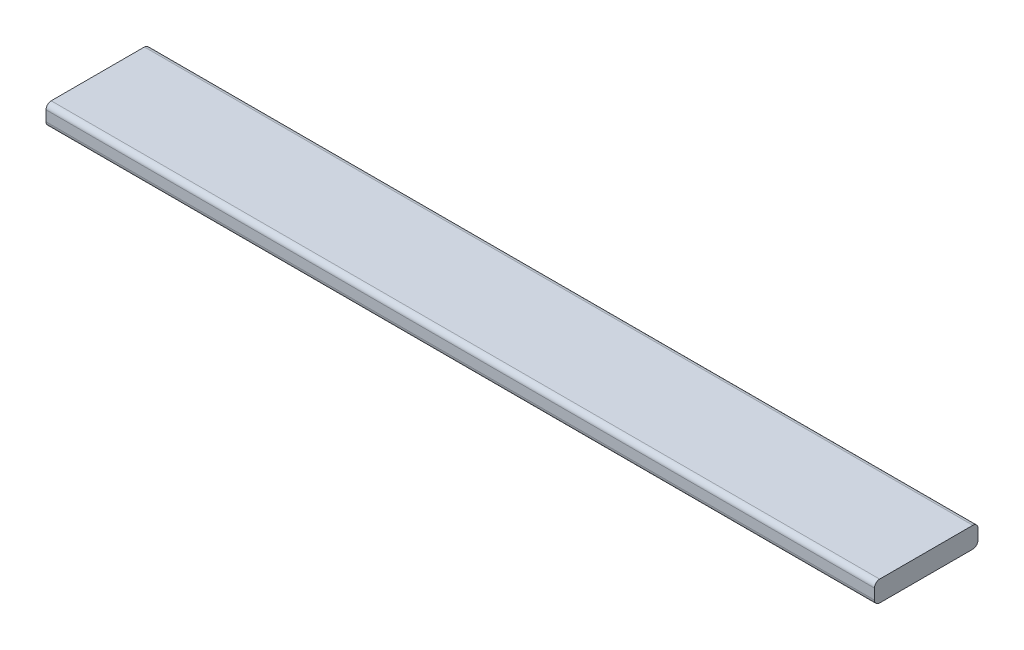
ISO-10303-21;
HEADER;
FILE_DESCRIPTION(('STEP AP214'),'2;1');
FILE_NAME('part.step','',(''),(''),'','','');
FILE_SCHEMA(('AUTOMOTIVE_DESIGN { 1 0 10303 214 1 1 1 1 }'));
ENDSEC;
DATA;
#1=APPLICATION_CONTEXT('core data for automotive mechanical design processes');
#2=APPLICATION_PROTOCOL_DEFINITION('international standard','automotive_design',2000,#1);
#3=PRODUCT_CONTEXT('',#1,'mechanical');
#4=PRODUCT('Part','Part','',(#3));
#5=PRODUCT_RELATED_PRODUCT_CATEGORY('part','',(#4));
#6=PRODUCT_DEFINITION_FORMATION('','',#4);
#7=PRODUCT_DEFINITION_CONTEXT('part definition',#1,'design');
#8=PRODUCT_DEFINITION('design','',#6,#7);
#9=PRODUCT_DEFINITION_SHAPE('','',#8);
#10=(LENGTH_UNIT() NAMED_UNIT(*) SI_UNIT(.MILLI.,.METRE.));
#11=(NAMED_UNIT(*) PLANE_ANGLE_UNIT() SI_UNIT($,.RADIAN.));
#12=(NAMED_UNIT(*) SI_UNIT($,.STERADIAN.) SOLID_ANGLE_UNIT());
#13=UNCERTAINTY_MEASURE_WITH_UNIT(LENGTH_MEASURE(1.E-05),#10,'distance_accuracy_value','');
#14=(GEOMETRIC_REPRESENTATION_CONTEXT(3) GLOBAL_UNCERTAINTY_ASSIGNED_CONTEXT((#13)) GLOBAL_UNIT_ASSIGNED_CONTEXT((#10,
#11,#12)) REPRESENTATION_CONTEXT('',''));
#15=CARTESIAN_POINT('',(0.,0.,0.));
#16=DIRECTION('',(0.,0.,1.));
#17=DIRECTION('',(1.,0.,0.));
#18=AXIS2_PLACEMENT_3D('',#15,#16,#17);
#19=CARTESIAN_POINT('',(60.,1.5,7.5));
#20=DIRECTION('',(-1.,0.,0.));
#21=DIRECTION('',(0.,0.,1.));
#22=AXIS2_PLACEMENT_3D('',#19,#20,#21);
#23=PLANE('',#22);
#24=DIRECTION('',(0.,0.,-1.));
#25=VECTOR('',#24,1.);
#26=CARTESIAN_POINT('',(60.,-1.5,7.5));
#27=LINE('',#26,#25);
#28=CARTESIAN_POINT('',(60.,-1.5,6.75));
#29=VERTEX_POINT('',#28);
#30=CARTESIAN_POINT('',(60.,-1.5,-6.75));
#31=VERTEX_POINT('',#30);
#32=EDGE_CURVE('E173',#29,#31,#27,.T.);
#33=ORIENTED_EDGE('',*,*,#32,.T.);
#34=CARTESIAN_POINT('',(60.,-0.75,-6.75));
#35=DIRECTION('',(-1.,0.,0.));
#36=DIRECTION('',(0.,0.,1.));
#37=AXIS2_PLACEMENT_3D('',#34,#35,#36);
#38=CIRCLE('',#37,0.75);
#39=CARTESIAN_POINT('',(60.,-0.75,-7.5));
#40=VERTEX_POINT('',#39);
#41=EDGE_CURVE('E147',#31,#40,#38,.F.);
#42=ORIENTED_EDGE('',*,*,#41,.T.);
#43=DIRECTION('',(0.,-1.,0.));
#44=VECTOR('',#43,1.);
#45=CARTESIAN_POINT('',(60.,1.5,-7.5));
#46=LINE('',#45,#44);
#47=CARTESIAN_POINT('',(60.,0.75,-7.5));
#48=VERTEX_POINT('',#47);
#49=EDGE_CURVE('E126',#48,#40,#46,.T.);
#50=ORIENTED_EDGE('',*,*,#49,.F.);
#51=CARTESIAN_POINT('',(60.,0.75,-6.75));
#52=DIRECTION('',(-1.,0.,0.));
#53=DIRECTION('',(0.,0.,1.));
#54=AXIS2_PLACEMENT_3D('',#51,#52,#53);
#55=CIRCLE('',#54,0.75);
#56=CARTESIAN_POINT('',(60.,1.5,-6.75));
#57=VERTEX_POINT('',#56);
#58=EDGE_CURVE('E131',#48,#57,#55,.F.);
#59=ORIENTED_EDGE('',*,*,#58,.T.);
#60=DIRECTION('',(0.,0.,-1.));
#61=VECTOR('',#60,1.);
#62=CARTESIAN_POINT('',(60.,1.5,7.5));
#63=LINE('',#62,#61);
#64=CARTESIAN_POINT('',(60.,1.5,6.75));
#65=VERTEX_POINT('',#64);
#66=EDGE_CURVE('E168',#65,#57,#63,.T.);
#67=ORIENTED_EDGE('',*,*,#66,.F.);
#68=CARTESIAN_POINT('',(60.,0.75,6.75));
#69=DIRECTION('',(-1.,0.,0.));
#70=DIRECTION('',(0.,0.,1.));
#71=AXIS2_PLACEMENT_3D('',#68,#69,#70);
#72=CIRCLE('',#71,0.75);
#73=CARTESIAN_POINT('',(60.,0.75,7.5));
#74=VERTEX_POINT('',#73);
#75=EDGE_CURVE('E61',#65,#74,#72,.F.);
#76=ORIENTED_EDGE('',*,*,#75,.T.);
#77=DIRECTION('',(0.,-1.,0.));
#78=VECTOR('',#77,1.);
#79=CARTESIAN_POINT('',(60.,1.5,7.5));
#80=LINE('',#79,#78);
#81=CARTESIAN_POINT('',(60.,-0.75,7.5));
#82=VERTEX_POINT('',#81);
#83=EDGE_CURVE('E158',#74,#82,#80,.T.);
#84=ORIENTED_EDGE('',*,*,#83,.T.);
#85=CARTESIAN_POINT('',(60.,-0.75,6.75));
#86=DIRECTION('',(-1.,0.,0.));
#87=DIRECTION('',(0.,0.,1.));
#88=AXIS2_PLACEMENT_3D('',#85,#86,#87);
#89=CIRCLE('',#88,0.75);
#90=EDGE_CURVE('E54',#82,#29,#89,.F.);
#91=ORIENTED_EDGE('',*,*,#90,.T.);
#92=EDGE_LOOP('',(#33,#42,#50,#59,#67,#76,#84,#91));
#93=FACE_BOUND('',#92,.T.);
#94=ADVANCED_FACE('F39',(#93),#23,.F.);
#95=CARTESIAN_POINT('',(-60.,1.5,-7.5));
#96=DIRECTION('',(0.,0.,1.));
#97=DIRECTION('',(1.,0.,0.));
#98=AXIS2_PLACEMENT_3D('',#95,#96,#97);
#99=PLANE('',#98);
#100=ORIENTED_EDGE('',*,*,#49,.T.);
#101=DIRECTION('',(-1.,0.,0.));
#102=VECTOR('',#101,1.);
#103=CARTESIAN_POINT('',(-60.,-0.75,-7.5));
#104=LINE('',#103,#102);
#105=CARTESIAN_POINT('',(-60.,-0.75,-7.5));
#106=VERTEX_POINT('',#105);
#107=EDGE_CURVE('E125',#40,#106,#104,.T.);
#108=ORIENTED_EDGE('',*,*,#107,.T.);
#109=DIRECTION('',(0.,-1.,0.));
#110=VECTOR('',#109,1.);
#111=CARTESIAN_POINT('',(-60.,1.5,-7.5));
#112=LINE('',#111,#110);
#113=CARTESIAN_POINT('',(-60.,0.75,-7.5));
#114=VERTEX_POINT('',#113);
#115=EDGE_CURVE('E108',#114,#106,#112,.T.);
#116=ORIENTED_EDGE('',*,*,#115,.F.);
#117=DIRECTION('',(-1.,0.,0.));
#118=VECTOR('',#117,1.);
#119=CARTESIAN_POINT('',(-60.,0.75,-7.5));
#120=LINE('',#119,#118);
#121=EDGE_CURVE('E122',#114,#48,#120,.F.);
#122=ORIENTED_EDGE('',*,*,#121,.T.);
#123=EDGE_LOOP('',(#100,#108,#116,#122));
#124=FACE_BOUND('',#123,.T.);
#125=ADVANCED_FACE('F121',(#124),#99,.F.);
#126=CARTESIAN_POINT('',(-60.,1.5,7.5));
#127=DIRECTION('',(1.,0.,0.));
#128=DIRECTION('',(0.,0.,-1.));
#129=AXIS2_PLACEMENT_3D('',#126,#127,#128);
#130=PLANE('',#129);
#131=ORIENTED_EDGE('',*,*,#115,.T.);
#132=CARTESIAN_POINT('',(-60.,-0.75,-6.75));
#133=DIRECTION('',(1.,0.,0.));
#134=DIRECTION('',(0.,0.,-1.));
#135=AXIS2_PLACEMENT_3D('',#132,#133,#134);
#136=CIRCLE('',#135,0.75);
#137=CARTESIAN_POINT('',(-60.,-1.5,-6.75));
#138=VERTEX_POINT('',#137);
#139=EDGE_CURVE('E115',#106,#138,#136,.F.);
#140=ORIENTED_EDGE('',*,*,#139,.T.);
#141=DIRECTION('',(0.,0.,1.));
#142=VECTOR('',#141,1.);
#143=CARTESIAN_POINT('',(-60.,-1.5,7.5));
#144=LINE('',#143,#142);
#145=CARTESIAN_POINT('',(-60.,-1.5,6.75));
#146=VERTEX_POINT('',#145);
#147=EDGE_CURVE('E170',#138,#146,#144,.T.);
#148=ORIENTED_EDGE('',*,*,#147,.T.);
#149=CARTESIAN_POINT('',(-60.,-0.75,6.75));
#150=DIRECTION('',(1.,0.,0.));
#151=DIRECTION('',(0.,0.,-1.));
#152=AXIS2_PLACEMENT_3D('',#149,#150,#151);
#153=CIRCLE('',#152,0.75);
#154=CARTESIAN_POINT('',(-60.,-0.75,7.5));
#155=VERTEX_POINT('',#154);
#156=EDGE_CURVE('E116',#146,#155,#153,.F.);
#157=ORIENTED_EDGE('',*,*,#156,.T.);
#158=DIRECTION('',(0.,-1.,0.));
#159=VECTOR('',#158,1.);
#160=CARTESIAN_POINT('',(-60.,1.5,7.5));
#161=LINE('',#160,#159);
#162=CARTESIAN_POINT('',(-60.,0.75,7.5));
#163=VERTEX_POINT('',#162);
#164=EDGE_CURVE('E127',#163,#155,#161,.T.);
#165=ORIENTED_EDGE('',*,*,#164,.F.);
#166=CARTESIAN_POINT('',(-60.,0.75,6.75));
#167=DIRECTION('',(1.,0.,0.));
#168=DIRECTION('',(0.,0.,-1.));
#169=AXIS2_PLACEMENT_3D('',#166,#167,#168);
#170=CIRCLE('',#169,0.75);
#171=CARTESIAN_POINT('',(-60.,1.5,6.75));
#172=VERTEX_POINT('',#171);
#173=EDGE_CURVE('E133',#163,#172,#170,.F.);
#174=ORIENTED_EDGE('',*,*,#173,.T.);
#175=DIRECTION('',(0.,0.,1.));
#176=VECTOR('',#175,1.);
#177=CARTESIAN_POINT('',(-60.,1.5,7.5));
#178=LINE('',#177,#176);
#179=CARTESIAN_POINT('',(-60.,1.5,-6.75));
#180=VERTEX_POINT('',#179);
#181=EDGE_CURVE('E110',#180,#172,#178,.T.);
#182=ORIENTED_EDGE('',*,*,#181,.F.);
#183=CARTESIAN_POINT('',(-60.,0.75,-6.75));
#184=DIRECTION('',(1.,0.,0.));
#185=DIRECTION('',(0.,0.,-1.));
#186=AXIS2_PLACEMENT_3D('',#183,#184,#185);
#187=CIRCLE('',#186,0.75);
#188=EDGE_CURVE('E105',#180,#114,#187,.F.);
#189=ORIENTED_EDGE('',*,*,#188,.T.);
#190=EDGE_LOOP('',(#131,#140,#148,#157,#165,#174,#182,#189));
#191=FACE_BOUND('',#190,.T.);
#192=ADVANCED_FACE('F107',(#191),#130,.F.);
#193=CARTESIAN_POINT('',(-60.,1.5,7.5));
#194=DIRECTION('',(0.,0.,-1.));
#195=DIRECTION('',(-1.,0.,0.));
#196=AXIS2_PLACEMENT_3D('',#193,#194,#195);
#197=PLANE('',#196);
#198=ORIENTED_EDGE('',*,*,#164,.T.);
#199=DIRECTION('',(1.,0.,0.));
#200=VECTOR('',#199,1.);
#201=CARTESIAN_POINT('',(60.,-0.75,7.5));
#202=LINE('',#201,#200);
#203=EDGE_CURVE('E11',#155,#82,#202,.T.);
#204=ORIENTED_EDGE('',*,*,#203,.T.);
#205=ORIENTED_EDGE('',*,*,#83,.F.);
#206=DIRECTION('',(1.,0.,0.));
#207=VECTOR('',#206,1.);
#208=CARTESIAN_POINT('',(-60.,0.75,7.5));
#209=LINE('',#208,#207);
#210=EDGE_CURVE('E47',#74,#163,#209,.F.);
#211=ORIENTED_EDGE('',*,*,#210,.T.);
#212=EDGE_LOOP('',(#198,#204,#205,#211));
#213=FACE_BOUND('',#212,.T.);
#214=ADVANCED_FACE('F157',(#213),#197,.F.);
#215=CARTESIAN_POINT('',(0.,1.5,0.));
#216=DIRECTION('',(0.,-1.,0.));
#217=DIRECTION('',(0.,0.,-1.));
#218=AXIS2_PLACEMENT_3D('',#215,#216,#217);
#219=PLANE('',#218);
#220=ORIENTED_EDGE('',*,*,#66,.T.);
#221=DIRECTION('',(-1.,0.,0.));
#222=VECTOR('',#221,1.);
#223=CARTESIAN_POINT('',(0.,1.5,-6.75));
#224=LINE('',#223,#222);
#225=EDGE_CURVE('E152',#57,#180,#224,.T.);
#226=ORIENTED_EDGE('',*,*,#225,.T.);
#227=ORIENTED_EDGE('',*,*,#181,.T.);
#228=DIRECTION('',(1.,0.,0.));
#229=VECTOR('',#228,1.);
#230=CARTESIAN_POINT('',(0.,1.5,6.75));
#231=LINE('',#230,#229);
#232=EDGE_CURVE('E149',#172,#65,#231,.T.);
#233=ORIENTED_EDGE('',*,*,#232,.T.);
#234=EDGE_LOOP('',(#220,#226,#227,#233));
#235=FACE_BOUND('',#234,.T.);
#236=ADVANCED_FACE('F167',(#235),#219,.F.);
#237=CARTESIAN_POINT('',(0.,-1.5,0.));
#238=DIRECTION('',(0.,-1.,0.));
#239=DIRECTION('',(0.,0.,-1.));
#240=AXIS2_PLACEMENT_3D('',#237,#238,#239);
#241=PLANE('',#240);
#242=ORIENTED_EDGE('',*,*,#147,.F.);
#243=DIRECTION('',(-1.,0.,0.));
#244=VECTOR('',#243,1.);
#245=CARTESIAN_POINT('',(60.,-1.5,-6.75));
#246=LINE('',#245,#244);
#247=EDGE_CURVE('E142',#138,#31,#246,.F.);
#248=ORIENTED_EDGE('',*,*,#247,.T.);
#249=ORIENTED_EDGE('',*,*,#32,.F.);
#250=DIRECTION('',(1.,0.,0.));
#251=VECTOR('',#250,1.);
#252=CARTESIAN_POINT('',(-60.,-1.5,6.75));
#253=LINE('',#252,#251);
#254=EDGE_CURVE('E140',#29,#146,#253,.F.);
#255=ORIENTED_EDGE('',*,*,#254,.T.);
#256=EDGE_LOOP('',(#242,#248,#249,#255));
#257=FACE_BOUND('',#256,.T.);
#258=ADVANCED_FACE('F181',(#257),#241,.T.);
#259=CARTESIAN_POINT('',(-60.,-0.75,-6.75));
#260=DIRECTION('',(1.,0.,0.));
#261=DIRECTION('',(0.,0.,-1.));
#262=AXIS2_PLACEMENT_3D('',#259,#260,#261);
#263=CYLINDRICAL_SURFACE('',#262,0.75);
#264=ORIENTED_EDGE('',*,*,#41,.F.);
#265=ORIENTED_EDGE('',*,*,#247,.F.);
#266=ORIENTED_EDGE('',*,*,#139,.F.);
#267=ORIENTED_EDGE('',*,*,#107,.F.);
#268=EDGE_LOOP('',(#264,#265,#266,#267));
#269=FACE_BOUND('',#268,.T.);
#270=ADVANCED_FACE('F189',(#269),#263,.T.);
#271=CARTESIAN_POINT('',(0.,0.75,-6.75));
#272=DIRECTION('',(-1.,0.,0.));
#273=DIRECTION('',(0.,0.,1.));
#274=AXIS2_PLACEMENT_3D('',#271,#272,#273);
#275=CYLINDRICAL_SURFACE('',#274,0.75);
#276=ORIENTED_EDGE('',*,*,#58,.F.);
#277=ORIENTED_EDGE('',*,*,#121,.F.);
#278=ORIENTED_EDGE('',*,*,#188,.F.);
#279=ORIENTED_EDGE('',*,*,#225,.F.);
#280=EDGE_LOOP('',(#276,#277,#278,#279));
#281=FACE_BOUND('',#280,.T.);
#282=ADVANCED_FACE('F130',(#281),#275,.T.);
#283=CARTESIAN_POINT('',(-60.,-0.75,6.75));
#284=DIRECTION('',(-1.,0.,0.));
#285=DIRECTION('',(0.,0.,1.));
#286=AXIS2_PLACEMENT_3D('',#283,#284,#285);
#287=CYLINDRICAL_SURFACE('',#286,0.75);
#288=ORIENTED_EDGE('',*,*,#156,.F.);
#289=ORIENTED_EDGE('',*,*,#254,.F.);
#290=ORIENTED_EDGE('',*,*,#90,.F.);
#291=ORIENTED_EDGE('',*,*,#203,.F.);
#292=EDGE_LOOP('',(#288,#289,#290,#291));
#293=FACE_BOUND('',#292,.T.);
#294=ADVANCED_FACE('F183',(#293),#287,.T.);
#295=CARTESIAN_POINT('',(0.,0.75,6.75));
#296=DIRECTION('',(1.,0.,0.));
#297=DIRECTION('',(0.,0.,-1.));
#298=AXIS2_PLACEMENT_3D('',#295,#296,#297);
#299=CYLINDRICAL_SURFACE('',#298,0.75);
#300=ORIENTED_EDGE('',*,*,#173,.F.);
#301=ORIENTED_EDGE('',*,*,#210,.F.);
#302=ORIENTED_EDGE('',*,*,#75,.F.);
#303=ORIENTED_EDGE('',*,*,#232,.F.);
#304=EDGE_LOOP('',(#300,#301,#302,#303));
#305=FACE_BOUND('',#304,.T.);
#306=ADVANCED_FACE('F41',(#305),#299,.T.);
#307=CLOSED_SHELL('',(#94,#125,#192,#214,#236,#258,#270,#282,#294,#306));
#308=MANIFOLD_SOLID_BREP('B2',#307);
#309=ADVANCED_BREP_SHAPE_REPRESENTATION('',(#18,#308),#14);
#310=SHAPE_DEFINITION_REPRESENTATION(#9,#309);
ENDSEC;
END-ISO-10303-21;
